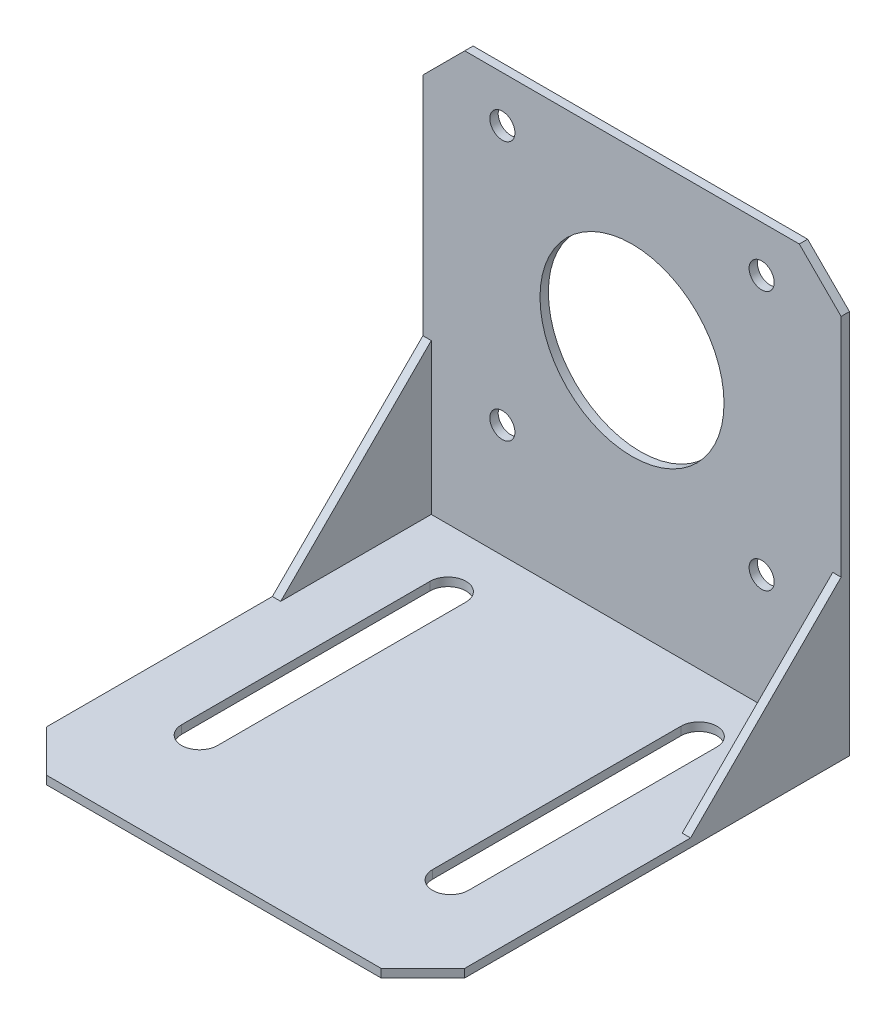
ISO-10303-21;
HEADER;
FILE_DESCRIPTION(('STEP AP214'),'2;1');
FILE_NAME('part.step','',(''),(''),'','','');
FILE_SCHEMA(('AUTOMOTIVE_DESIGN { 1 0 10303 214 1 1 1 1 }'));
ENDSEC;
DATA;
#1=APPLICATION_CONTEXT('core data for automotive mechanical design processes');
#2=APPLICATION_PROTOCOL_DEFINITION('international standard','automotive_design',2000,#1);
#3=PRODUCT_CONTEXT('',#1,'mechanical');
#4=PRODUCT('Part','Part','',(#3));
#5=PRODUCT_RELATED_PRODUCT_CATEGORY('part','',(#4));
#6=PRODUCT_DEFINITION_FORMATION('','',#4);
#7=PRODUCT_DEFINITION_CONTEXT('part definition',#1,'design');
#8=PRODUCT_DEFINITION('design','',#6,#7);
#9=PRODUCT_DEFINITION_SHAPE('','',#8);
#10=(LENGTH_UNIT() NAMED_UNIT(*) SI_UNIT(.MILLI.,.METRE.));
#11=(NAMED_UNIT(*) PLANE_ANGLE_UNIT() SI_UNIT($,.RADIAN.));
#12=(NAMED_UNIT(*) SI_UNIT($,.STERADIAN.) SOLID_ANGLE_UNIT());
#13=UNCERTAINTY_MEASURE_WITH_UNIT(LENGTH_MEASURE(1.E-05),#10,'distance_accuracy_value','');
#14=(GEOMETRIC_REPRESENTATION_CONTEXT(3) GLOBAL_UNCERTAINTY_ASSIGNED_CONTEXT((#13)) GLOBAL_UNIT_ASSIGNED_CONTEXT((#10,
#11,#12)) REPRESENTATION_CONTEXT('',''));
#15=CARTESIAN_POINT('',(0.,0.,0.));
#16=DIRECTION('',(0.,0.,1.));
#17=DIRECTION('',(1.,0.,0.));
#18=AXIS2_PLACEMENT_3D('',#15,#16,#17);
#19=CARTESIAN_POINT('',(0.,1.,0.));
#20=DIRECTION('',(0.,1.,0.));
#21=DIRECTION('',(0.,0.,1.));
#22=AXIS2_PLACEMENT_3D('',#19,#20,#21);
#23=PLANE('',#22);
#24=DIRECTION('',(1.,0.,0.));
#25=VECTOR('',#24,1.);
#26=CARTESIAN_POINT('',(0.,1.,-6.49999999999972));
#27=LINE('',#26,#25);
#28=CARTESIAN_POINT('',(24.,1.,-6.49999999999972));
#29=VERTEX_POINT('',#28);
#30=CARTESIAN_POINT('',(25.,0.999999999999998,-6.49999999999972));
#31=VERTEX_POINT('',#30);
#32=EDGE_CURVE('E353',#29,#31,#27,.T.);
#33=ORIENTED_EDGE('',*,*,#32,.F.);
#34=DIRECTION('',(0.,0.,1.));
#35=VECTOR('',#34,1.);
#36=CARTESIAN_POINT('',(24.,1.,0.));
#37=LINE('',#36,#35);
#38=CARTESIAN_POINT('',(24.,1.,-24.4999999999999));
#39=VERTEX_POINT('',#38);
#40=EDGE_CURVE('E509',#39,#29,#37,.T.);
#41=ORIENTED_EDGE('',*,*,#40,.F.);
#42=DIRECTION('',(1.,0.,0.));
#43=VECTOR('',#42,1.);
#44=CARTESIAN_POINT('',(0.,1.,-24.4999999999999));
#45=LINE('',#44,#43);
#46=CARTESIAN_POINT('',(-24.,1.,-24.4999999999999));
#47=VERTEX_POINT('',#46);
#48=EDGE_CURVE('E397',#47,#39,#45,.T.);
#49=ORIENTED_EDGE('',*,*,#48,.F.);
#50=DIRECTION('',(0.,0.,1.));
#51=VECTOR('',#50,1.);
#52=CARTESIAN_POINT('',(-24.,1.,0.));
#53=LINE('',#52,#51);
#54=CARTESIAN_POINT('',(-24.,1.,-6.4999999999997));
#55=VERTEX_POINT('',#54);
#56=EDGE_CURVE('E216',#47,#55,#53,.T.);
#57=ORIENTED_EDGE('',*,*,#56,.T.);
#58=DIRECTION('',(1.,0.,0.));
#59=VECTOR('',#58,1.);
#60=CARTESIAN_POINT('',(0.,1.,-6.49999999999971));
#61=LINE('',#60,#59);
#62=CARTESIAN_POINT('',(-25.,1.,-6.49999999999971));
#63=VERTEX_POINT('',#62);
#64=EDGE_CURVE('E220',#63,#55,#61,.T.);
#65=ORIENTED_EDGE('',*,*,#64,.F.);
#66=DIRECTION('',(0.,0.,1.));
#67=VECTOR('',#66,1.);
#68=CARTESIAN_POINT('',(-25.,1.,-25.4999999999999));
#69=LINE('',#68,#67);
#70=CARTESIAN_POINT('',(-25.,1.,20.5000000000001));
#71=VERTEX_POINT('',#70);
#72=EDGE_CURVE('E462',#63,#71,#69,.T.);
#73=ORIENTED_EDGE('',*,*,#72,.T.);
#74=DIRECTION('',(0.707106781186548,0.,0.707106781186548));
#75=VECTOR('',#74,1.);
#76=CARTESIAN_POINT('',(-25.,1.,20.5000000000001));
#77=LINE('',#76,#75);
#78=CARTESIAN_POINT('',(-20.,1.,25.5000000000001));
#79=VERTEX_POINT('',#78);
#80=EDGE_CURVE('E464',#71,#79,#77,.T.);
#81=ORIENTED_EDGE('',*,*,#80,.T.);
#82=DIRECTION('',(1.,0.,0.));
#83=VECTOR('',#82,1.);
#84=CARTESIAN_POINT('',(-20.,1.,25.5000000000001));
#85=LINE('',#84,#83);
#86=CARTESIAN_POINT('',(20.,1.,25.5000000000001));
#87=VERTEX_POINT('',#86);
#88=EDGE_CURVE('E467',#79,#87,#85,.T.);
#89=ORIENTED_EDGE('',*,*,#88,.T.);
#90=DIRECTION('',(0.707106781186548,0.,-0.707106781186548));
#91=VECTOR('',#90,1.);
#92=CARTESIAN_POINT('',(20.,1.,25.5000000000001));
#93=LINE('',#92,#91);
#94=CARTESIAN_POINT('',(25.,1.,20.5000000000001));
#95=VERTEX_POINT('',#94);
#96=EDGE_CURVE('E469',#87,#95,#93,.T.);
#97=ORIENTED_EDGE('',*,*,#96,.T.);
#98=DIRECTION('',(0.,0.,1.));
#99=VECTOR('',#98,1.);
#100=CARTESIAN_POINT('',(25.,1.,-25.4999999999999));
#101=LINE('',#100,#99);
#102=EDGE_CURVE('E472',#31,#95,#101,.T.);
#103=ORIENTED_EDGE('',*,*,#102,.F.);
#104=EDGE_LOOP('',(#33,#41,#49,#57,#65,#73,#81,#89,#97,#103));
#105=FACE_BOUND('',#104,.T.);
#106=CARTESIAN_POINT('',(-15.,1.,12.2000000000001));
#107=DIRECTION('',(0.,1.,0.));
#108=DIRECTION('',(0.,0.,1.));
#109=AXIS2_PLACEMENT_3D('',#106,#107,#108);
#110=CIRCLE('',#109,2.15);
#111=CARTESIAN_POINT('',(-17.15,1.,12.2000000000001));
#112=VERTEX_POINT('',#111);
#113=CARTESIAN_POINT('',(-12.85,1.,12.2000000000001));
#114=VERTEX_POINT('',#113);
#115=EDGE_CURVE('E433',#112,#114,#110,.T.);
#116=ORIENTED_EDGE('',*,*,#115,.F.);
#117=DIRECTION('',(0.,0.,1.));
#118=VECTOR('',#117,1.);
#119=CARTESIAN_POINT('',(-17.15,1.,0.));
#120=LINE('',#119,#118);
#121=CARTESIAN_POINT('',(-17.15,1.,-17.4999999999999));
#122=VERTEX_POINT('',#121);
#123=EDGE_CURVE('E431',#122,#112,#120,.T.);
#124=ORIENTED_EDGE('',*,*,#123,.F.);
#125=CARTESIAN_POINT('',(-15.,1.,-17.4999999999999));
#126=DIRECTION('',(0.,1.,0.));
#127=DIRECTION('',(0.,0.,1.));
#128=AXIS2_PLACEMENT_3D('',#125,#126,#127);
#129=CIRCLE('',#128,2.15);
#130=CARTESIAN_POINT('',(-12.85,1.,-17.4999999999999));
#131=VERTEX_POINT('',#130);
#132=EDGE_CURVE('E439',#131,#122,#129,.T.);
#133=ORIENTED_EDGE('',*,*,#132,.F.);
#134=DIRECTION('',(0.,0.,1.));
#135=VECTOR('',#134,1.);
#136=CARTESIAN_POINT('',(-12.85,1.,0.));
#137=LINE('',#136,#135);
#138=EDGE_CURVE('E436',#131,#114,#137,.T.);
#139=ORIENTED_EDGE('',*,*,#138,.T.);
#140=EDGE_LOOP('',(#116,#124,#133,#139));
#141=FACE_BOUND('',#140,.T.);
#142=CARTESIAN_POINT('',(15.,1.,12.2000000000001));
#143=DIRECTION('',(0.,1.,0.));
#144=DIRECTION('',(0.,0.,1.));
#145=AXIS2_PLACEMENT_3D('',#142,#143,#144);
#146=CIRCLE('',#145,2.15);
#147=CARTESIAN_POINT('',(12.85,1.,12.2000000000001));
#148=VERTEX_POINT('',#147);
#149=CARTESIAN_POINT('',(17.15,1.,12.2000000000001));
#150=VERTEX_POINT('',#149);
#151=EDGE_CURVE('E402',#148,#150,#146,.T.);
#152=ORIENTED_EDGE('',*,*,#151,.F.);
#153=DIRECTION('',(0.,0.,1.));
#154=VECTOR('',#153,1.);
#155=CARTESIAN_POINT('',(12.85,1.,0.));
#156=LINE('',#155,#154);
#157=CARTESIAN_POINT('',(12.85,1.,-17.4999999999999));
#158=VERTEX_POINT('',#157);
#159=EDGE_CURVE('E400',#158,#148,#156,.T.);
#160=ORIENTED_EDGE('',*,*,#159,.F.);
#161=CARTESIAN_POINT('',(15.,1.,-17.4999999999999));
#162=DIRECTION('',(0.,1.,0.));
#163=DIRECTION('',(0.,0.,1.));
#164=AXIS2_PLACEMENT_3D('',#161,#162,#163);
#165=CIRCLE('',#164,2.15);
#166=CARTESIAN_POINT('',(17.15,1.,-17.4999999999999));
#167=VERTEX_POINT('',#166);
#168=EDGE_CURVE('E408',#167,#158,#165,.T.);
#169=ORIENTED_EDGE('',*,*,#168,.F.);
#170=DIRECTION('',(0.,0.,1.));
#171=VECTOR('',#170,1.);
#172=CARTESIAN_POINT('',(17.15,1.,0.));
#173=LINE('',#172,#171);
#174=EDGE_CURVE('E405',#167,#150,#173,.T.);
#175=ORIENTED_EDGE('',*,*,#174,.T.);
#176=EDGE_LOOP('',(#152,#160,#169,#175));
#177=FACE_BOUND('',#176,.T.);
#178=ADVANCED_FACE('F201',(#105,#141,#177),#23,.T.);
#179=CARTESIAN_POINT('',(0.,0.,0.));
#180=DIRECTION('',(0.,1.,0.));
#181=DIRECTION('',(0.,0.,1.));
#182=AXIS2_PLACEMENT_3D('',#179,#180,#181);
#183=PLANE('',#182);
#184=DIRECTION('',(0.,0.,1.));
#185=VECTOR('',#184,1.);
#186=CARTESIAN_POINT('',(25.,0.,-25.4999999999999));
#187=LINE('',#186,#185);
#188=CARTESIAN_POINT('',(25.,0.,-25.4999999999999));
#189=VERTEX_POINT('',#188);
#190=CARTESIAN_POINT('',(25.,0.,20.5000000000001));
#191=VERTEX_POINT('',#190);
#192=EDGE_CURVE('E483',#189,#191,#187,.T.);
#193=ORIENTED_EDGE('',*,*,#192,.T.);
#194=DIRECTION('',(0.707106781186548,0.,-0.707106781186548));
#195=VECTOR('',#194,1.);
#196=CARTESIAN_POINT('',(20.,0.,25.5000000000001));
#197=LINE('',#196,#195);
#198=CARTESIAN_POINT('',(20.,0.,25.5000000000001));
#199=VERTEX_POINT('',#198);
#200=EDGE_CURVE('E480',#199,#191,#197,.T.);
#201=ORIENTED_EDGE('',*,*,#200,.F.);
#202=DIRECTION('',(1.,0.,0.));
#203=VECTOR('',#202,1.);
#204=CARTESIAN_POINT('',(-20.,0.,25.5000000000001));
#205=LINE('',#204,#203);
#206=CARTESIAN_POINT('',(-20.,0.,25.5000000000001));
#207=VERTEX_POINT('',#206);
#208=EDGE_CURVE('E478',#207,#199,#205,.T.);
#209=ORIENTED_EDGE('',*,*,#208,.F.);
#210=DIRECTION('',(0.707106781186548,0.,0.707106781186548));
#211=VECTOR('',#210,1.);
#212=CARTESIAN_POINT('',(-25.,0.,20.5000000000001));
#213=LINE('',#212,#211);
#214=CARTESIAN_POINT('',(-25.,0.,20.5000000000001));
#215=VERTEX_POINT('',#214);
#216=EDGE_CURVE('E476',#215,#207,#213,.T.);
#217=ORIENTED_EDGE('',*,*,#216,.F.);
#218=DIRECTION('',(0.,0.,1.));
#219=VECTOR('',#218,1.);
#220=CARTESIAN_POINT('',(-25.,0.,-25.4999999999999));
#221=LINE('',#220,#219);
#222=CARTESIAN_POINT('',(-25.,0.,-25.4999999999999));
#223=VERTEX_POINT('',#222);
#224=EDGE_CURVE('E461',#223,#215,#221,.T.);
#225=ORIENTED_EDGE('',*,*,#224,.F.);
#226=DIRECTION('',(1.,0.,0.));
#227=VECTOR('',#226,1.);
#228=CARTESIAN_POINT('',(-25.,0.,-25.4999999999999));
#229=LINE('',#228,#227);
#230=EDGE_CURVE('E465',#223,#189,#229,.T.);
#231=ORIENTED_EDGE('',*,*,#230,.T.);
#232=EDGE_LOOP('',(#193,#201,#209,#217,#225,#231));
#233=FACE_BOUND('',#232,.T.);
#234=DIRECTION('',(0.,0.,1.));
#235=VECTOR('',#234,1.);
#236=CARTESIAN_POINT('',(-17.15,0.,0.));
#237=LINE('',#236,#235);
#238=CARTESIAN_POINT('',(-17.15,0.,-17.4999999999999));
#239=VERTEX_POINT('',#238);
#240=CARTESIAN_POINT('',(-17.15,0.,12.2000000000001));
#241=VERTEX_POINT('',#240);
#242=EDGE_CURVE('E430',#239,#241,#237,.T.);
#243=ORIENTED_EDGE('',*,*,#242,.T.);
#244=CARTESIAN_POINT('',(-15.,0.,12.2000000000001));
#245=DIRECTION('',(0.,1.,0.));
#246=DIRECTION('',(0.,0.,1.));
#247=AXIS2_PLACEMENT_3D('',#244,#245,#246);
#248=CIRCLE('',#247,2.15);
#249=CARTESIAN_POINT('',(-12.85,0.,12.2000000000001));
#250=VERTEX_POINT('',#249);
#251=EDGE_CURVE('E444',#241,#250,#248,.T.);
#252=ORIENTED_EDGE('',*,*,#251,.T.);
#253=DIRECTION('',(0.,0.,1.));
#254=VECTOR('',#253,1.);
#255=CARTESIAN_POINT('',(-12.85,0.,0.));
#256=LINE('',#255,#254);
#257=CARTESIAN_POINT('',(-12.85,0.,-17.4999999999999));
#258=VERTEX_POINT('',#257);
#259=EDGE_CURVE('E447',#258,#250,#256,.T.);
#260=ORIENTED_EDGE('',*,*,#259,.F.);
#261=CARTESIAN_POINT('',(-15.,0.,-17.4999999999999));
#262=DIRECTION('',(0.,1.,0.));
#263=DIRECTION('',(0.,0.,1.));
#264=AXIS2_PLACEMENT_3D('',#261,#262,#263);
#265=CIRCLE('',#264,2.15);
#266=EDGE_CURVE('E434',#258,#239,#265,.T.);
#267=ORIENTED_EDGE('',*,*,#266,.T.);
#268=EDGE_LOOP('',(#243,#252,#260,#267));
#269=FACE_BOUND('',#268,.T.);
#270=DIRECTION('',(0.,0.,1.));
#271=VECTOR('',#270,1.);
#272=CARTESIAN_POINT('',(12.85,0.,0.));
#273=LINE('',#272,#271);
#274=CARTESIAN_POINT('',(12.85,0.,-17.4999999999999));
#275=VERTEX_POINT('',#274);
#276=CARTESIAN_POINT('',(12.85,0.,12.2000000000001));
#277=VERTEX_POINT('',#276);
#278=EDGE_CURVE('E399',#275,#277,#273,.T.);
#279=ORIENTED_EDGE('',*,*,#278,.T.);
#280=CARTESIAN_POINT('',(15.,0.,12.2000000000001));
#281=DIRECTION('',(0.,1.,0.));
#282=DIRECTION('',(0.,0.,1.));
#283=AXIS2_PLACEMENT_3D('',#280,#281,#282);
#284=CIRCLE('',#283,2.15);
#285=CARTESIAN_POINT('',(17.15,0.,12.2000000000001));
#286=VERTEX_POINT('',#285);
#287=EDGE_CURVE('E413',#277,#286,#284,.T.);
#288=ORIENTED_EDGE('',*,*,#287,.T.);
#289=DIRECTION('',(0.,0.,1.));
#290=VECTOR('',#289,1.);
#291=CARTESIAN_POINT('',(17.15,0.,0.));
#292=LINE('',#291,#290);
#293=CARTESIAN_POINT('',(17.15,0.,-17.4999999999999));
#294=VERTEX_POINT('',#293);
#295=EDGE_CURVE('E416',#294,#286,#292,.T.);
#296=ORIENTED_EDGE('',*,*,#295,.F.);
#297=CARTESIAN_POINT('',(15.,0.,-17.4999999999999));
#298=DIRECTION('',(0.,1.,0.));
#299=DIRECTION('',(0.,0.,1.));
#300=AXIS2_PLACEMENT_3D('',#297,#298,#299);
#301=CIRCLE('',#300,2.15);
#302=EDGE_CURVE('E403',#294,#275,#301,.T.);
#303=ORIENTED_EDGE('',*,*,#302,.T.);
#304=EDGE_LOOP('',(#279,#288,#296,#303));
#305=FACE_BOUND('',#304,.T.);
#306=ADVANCED_FACE('F586',(#233,#269,#305),#183,.F.);
#307=CARTESIAN_POINT('',(-25.,1.,-25.4999999999999));
#308=DIRECTION('',(1.,0.,0.));
#309=DIRECTION('',(0.,0.,-1.));
#310=AXIS2_PLACEMENT_3D('',#307,#308,#309);
#311=PLANE('',#310);
#312=ORIENTED_EDGE('',*,*,#72,.F.);
#313=DIRECTION('',(0.,0.707106781186544,-0.707106781186551));
#314=VECTOR('',#313,1.);
#315=CARTESIAN_POINT('',(-25.,0.,-5.49999999999969));
#316=LINE('',#315,#314);
#317=CARTESIAN_POINT('',(-25.,19.,-24.4999999999999));
#318=VERTEX_POINT('',#317);
#319=EDGE_CURVE('E522',#63,#318,#316,.T.);
#320=ORIENTED_EDGE('',*,*,#319,.T.);
#321=DIRECTION('',(0.,-1.,0.));
#322=VECTOR('',#321,1.);
#323=CARTESIAN_POINT('',(-25.,46.,-24.4999999999999));
#324=LINE('',#323,#322);
#325=CARTESIAN_POINT('',(-25.,46.,-24.4999999999999));
#326=VERTEX_POINT('',#325);
#327=EDGE_CURVE('E371',#326,#318,#324,.T.);
#328=ORIENTED_EDGE('',*,*,#327,.F.);
#329=DIRECTION('',(0.,0.,-1.));
#330=VECTOR('',#329,1.);
#331=CARTESIAN_POINT('',(-25.,46.,-24.4999999999999));
#332=LINE('',#331,#330);
#333=CARTESIAN_POINT('',(-25.,46.,-25.4999999999999));
#334=VERTEX_POINT('',#333);
#335=EDGE_CURVE('E373',#326,#334,#332,.T.);
#336=ORIENTED_EDGE('',*,*,#335,.T.);
#337=DIRECTION('',(0.,-1.,0.));
#338=VECTOR('',#337,1.);
#339=CARTESIAN_POINT('',(-25.,1.,-25.4999999999999));
#340=LINE('',#339,#338);
#341=EDGE_CURVE('E474',#334,#223,#340,.T.);
#342=ORIENTED_EDGE('',*,*,#341,.T.);
#343=ORIENTED_EDGE('',*,*,#224,.T.);
#344=DIRECTION('',(0.,-1.,0.));
#345=VECTOR('',#344,1.);
#346=CARTESIAN_POINT('',(-25.,1.,20.5000000000001));
#347=LINE('',#346,#345);
#348=EDGE_CURVE('E499',#71,#215,#347,.T.);
#349=ORIENTED_EDGE('',*,*,#348,.F.);
#350=EDGE_LOOP('',(#312,#320,#328,#336,#342,#343,#349));
#351=FACE_BOUND('',#350,.T.);
#352=ADVANCED_FACE('F203',(#351),#311,.F.);
#353=CARTESIAN_POINT('',(-25.,1.,20.5000000000001));
#354=DIRECTION('',(0.707106781186547,0.,-0.707106781186547));
#355=DIRECTION('',(-0.707106781186548,0.,-0.707106781186548));
#356=AXIS2_PLACEMENT_3D('',#353,#354,#355);
#357=PLANE('',#356);
#358=ORIENTED_EDGE('',*,*,#216,.T.);
#359=DIRECTION('',(0.,-1.,0.));
#360=VECTOR('',#359,1.);
#361=CARTESIAN_POINT('',(-20.,1.,25.5000000000001));
#362=LINE('',#361,#360);
#363=EDGE_CURVE('E496',#79,#207,#362,.T.);
#364=ORIENTED_EDGE('',*,*,#363,.F.);
#365=ORIENTED_EDGE('',*,*,#80,.F.);
#366=ORIENTED_EDGE('',*,*,#348,.T.);
#367=EDGE_LOOP('',(#358,#364,#365,#366));
#368=FACE_BOUND('',#367,.T.);
#369=ADVANCED_FACE('F572',(#368),#357,.F.);
#370=CARTESIAN_POINT('',(-20.,1.,25.5000000000001));
#371=DIRECTION('',(0.,0.,-1.));
#372=DIRECTION('',(-1.,0.,0.));
#373=AXIS2_PLACEMENT_3D('',#370,#371,#372);
#374=PLANE('',#373);
#375=ORIENTED_EDGE('',*,*,#208,.T.);
#376=DIRECTION('',(0.,-1.,0.));
#377=VECTOR('',#376,1.);
#378=CARTESIAN_POINT('',(20.,1.,25.5000000000001));
#379=LINE('',#378,#377);
#380=EDGE_CURVE('E493',#87,#199,#379,.T.);
#381=ORIENTED_EDGE('',*,*,#380,.F.);
#382=ORIENTED_EDGE('',*,*,#88,.F.);
#383=ORIENTED_EDGE('',*,*,#363,.T.);
#384=EDGE_LOOP('',(#375,#381,#382,#383));
#385=FACE_BOUND('',#384,.T.);
#386=ADVANCED_FACE('F578',(#385),#374,.F.);
#387=CARTESIAN_POINT('',(20.,1.,25.5000000000001));
#388=DIRECTION('',(-0.707106781186547,0.,-0.707106781186547));
#389=DIRECTION('',(-0.707106781186548,0.,0.707106781186548));
#390=AXIS2_PLACEMENT_3D('',#387,#388,#389);
#391=PLANE('',#390);
#392=ORIENTED_EDGE('',*,*,#200,.T.);
#393=DIRECTION('',(0.,-1.,0.));
#394=VECTOR('',#393,1.);
#395=CARTESIAN_POINT('',(25.,1.,20.5000000000001));
#396=LINE('',#395,#394);
#397=EDGE_CURVE('E490',#95,#191,#396,.T.);
#398=ORIENTED_EDGE('',*,*,#397,.F.);
#399=ORIENTED_EDGE('',*,*,#96,.F.);
#400=ORIENTED_EDGE('',*,*,#380,.T.);
#401=EDGE_LOOP('',(#392,#398,#399,#400));
#402=FACE_BOUND('',#401,.T.);
#403=ADVANCED_FACE('F582',(#402),#391,.F.);
#404=CARTESIAN_POINT('',(25.,1.,-25.4999999999999));
#405=DIRECTION('',(1.,0.,0.));
#406=DIRECTION('',(0.,0.,-1.));
#407=AXIS2_PLACEMENT_3D('',#404,#405,#406);
#408=PLANE('',#407);
#409=DIRECTION('',(0.,-0.707106781186544,0.707106781186551));
#410=VECTOR('',#409,1.);
#411=CARTESIAN_POINT('',(25.,0.,-5.49999999999971));
#412=LINE('',#411,#410);
#413=CARTESIAN_POINT('',(25.,19.,-24.4999999999999));
#414=VERTEX_POINT('',#413);
#415=EDGE_CURVE('E347',#414,#31,#412,.T.);
#416=ORIENTED_EDGE('',*,*,#415,.T.);
#417=ORIENTED_EDGE('',*,*,#102,.T.);
#418=ORIENTED_EDGE('',*,*,#397,.T.);
#419=ORIENTED_EDGE('',*,*,#192,.F.);
#420=DIRECTION('',(0.,-1.,0.));
#421=VECTOR('',#420,1.);
#422=CARTESIAN_POINT('',(25.,1.,-25.4999999999999));
#423=LINE('',#422,#421);
#424=CARTESIAN_POINT('',(25.,46.,-25.4999999999999));
#425=VERTEX_POINT('',#424);
#426=EDGE_CURVE('E487',#425,#189,#423,.T.);
#427=ORIENTED_EDGE('',*,*,#426,.F.);
#428=DIRECTION('',(0.,0.,-1.));
#429=VECTOR('',#428,1.);
#430=CARTESIAN_POINT('',(25.,46.,-24.4999999999999));
#431=LINE('',#430,#429);
#432=CARTESIAN_POINT('',(25.,46.,-24.4999999999999));
#433=VERTEX_POINT('',#432);
#434=EDGE_CURVE('E369',#433,#425,#431,.T.);
#435=ORIENTED_EDGE('',*,*,#434,.F.);
#436=DIRECTION('',(0.,-1.,0.));
#437=VECTOR('',#436,1.);
#438=CARTESIAN_POINT('',(25.,46.,-24.4999999999999));
#439=LINE('',#438,#437);
#440=EDGE_CURVE('E365',#433,#414,#439,.T.);
#441=ORIENTED_EDGE('',*,*,#440,.T.);
#442=EDGE_LOOP('',(#416,#417,#418,#419,#427,#435,#441));
#443=FACE_BOUND('',#442,.T.);
#444=ADVANCED_FACE('F367',(#443),#408,.T.);
#445=CARTESIAN_POINT('',(-25.,1.,-25.4999999999999));
#446=DIRECTION('',(0.,0.,-1.));
#447=DIRECTION('',(-1.,0.,0.));
#448=AXIS2_PLACEMENT_3D('',#445,#446,#447);
#449=PLANE('',#448);
#450=ORIENTED_EDGE('',*,*,#426,.T.);
#451=ORIENTED_EDGE('',*,*,#230,.F.);
#452=ORIENTED_EDGE('',*,*,#341,.F.);
#453=DIRECTION('',(-0.707106781186548,-0.707106781186547,0.));
#454=VECTOR('',#453,1.);
#455=CARTESIAN_POINT('',(-20.,51.,-25.4999999999999));
#456=LINE('',#455,#454);
#457=CARTESIAN_POINT('',(-20.,51.,-25.4999999999999));
#458=VERTEX_POINT('',#457);
#459=EDGE_CURVE('E385',#458,#334,#456,.T.);
#460=ORIENTED_EDGE('',*,*,#459,.F.);
#461=DIRECTION('',(-1.,0.,0.));
#462=VECTOR('',#461,1.);
#463=CARTESIAN_POINT('',(20.,51.,-25.4999999999999));
#464=LINE('',#463,#462);
#465=CARTESIAN_POINT('',(20.,51.,-25.4999999999999));
#466=VERTEX_POINT('',#465);
#467=EDGE_CURVE('E382',#466,#458,#464,.T.);
#468=ORIENTED_EDGE('',*,*,#467,.F.);
#469=DIRECTION('',(-0.707106781186547,0.707106781186547,0.));
#470=VECTOR('',#469,1.);
#471=CARTESIAN_POINT('',(25.,46.,-25.4999999999999));
#472=LINE('',#471,#470);
#473=EDGE_CURVE('E379',#425,#466,#472,.T.);
#474=ORIENTED_EDGE('',*,*,#473,.F.);
#475=EDGE_LOOP('',(#450,#451,#452,#460,#468,#474));
#476=FACE_BOUND('',#475,.T.);
#477=CARTESIAN_POINT('',(15.5,14.5,-25.4999999999999));
#478=DIRECTION('',(0.,0.,-1.));
#479=DIRECTION('',(-1.,0.,0.));
#480=AXIS2_PLACEMENT_3D('',#477,#478,#479);
#481=CIRCLE('',#480,1.5);
#482=CARTESIAN_POINT('',(14.,14.5,-25.4999999999999));
#483=VERTEX_POINT('',#482);
#484=EDGE_CURVE('E529',#483,#483,#481,.T.);
#485=ORIENTED_EDGE('',*,*,#484,.F.);
#486=EDGE_LOOP('',(#485));
#487=FACE_BOUND('',#486,.T.);
#488=CARTESIAN_POINT('',(-15.5,14.5,-25.4999999999999));
#489=DIRECTION('',(0.,0.,-1.));
#490=DIRECTION('',(-1.,0.,0.));
#491=AXIS2_PLACEMENT_3D('',#488,#489,#490);
#492=CIRCLE('',#491,1.5);
#493=CARTESIAN_POINT('',(-17.,14.5,-25.4999999999999));
#494=VERTEX_POINT('',#493);
#495=EDGE_CURVE('E533',#494,#494,#492,.T.);
#496=ORIENTED_EDGE('',*,*,#495,.F.);
#497=EDGE_LOOP('',(#496));
#498=FACE_BOUND('',#497,.T.);
#499=CARTESIAN_POINT('',(-15.5,45.5,-25.4999999999999));
#500=DIRECTION('',(0.,0.,-1.));
#501=DIRECTION('',(-1.,0.,0.));
#502=AXIS2_PLACEMENT_3D('',#499,#500,#501);
#503=CIRCLE('',#502,1.5);
#504=CARTESIAN_POINT('',(-17.,45.5,-25.4999999999999));
#505=VERTEX_POINT('',#504);
#506=EDGE_CURVE('E539',#505,#505,#503,.T.);
#507=ORIENTED_EDGE('',*,*,#506,.F.);
#508=EDGE_LOOP('',(#507));
#509=FACE_BOUND('',#508,.T.);
#510=CARTESIAN_POINT('',(15.5,45.5,-25.4999999999999));
#511=DIRECTION('',(0.,0.,-1.));
#512=DIRECTION('',(-1.,0.,0.));
#513=AXIS2_PLACEMENT_3D('',#510,#511,#512);
#514=CIRCLE('',#513,1.5);
#515=CARTESIAN_POINT('',(14.,45.5,-25.4999999999999));
#516=VERTEX_POINT('',#515);
#517=EDGE_CURVE('E545',#516,#516,#514,.T.);
#518=ORIENTED_EDGE('',*,*,#517,.F.);
#519=EDGE_LOOP('',(#518));
#520=FACE_BOUND('',#519,.T.);
#521=CARTESIAN_POINT('',(0.,30.,-25.4999999999999));
#522=DIRECTION('',(0.,0.,-1.));
#523=DIRECTION('',(-1.,0.,0.));
#524=AXIS2_PLACEMENT_3D('',#521,#522,#523);
#525=CIRCLE('',#524,11.);
#526=CARTESIAN_POINT('',(-11.,30.,-25.4999999999999));
#527=VERTEX_POINT('',#526);
#528=EDGE_CURVE('E551',#527,#527,#525,.T.);
#529=ORIENTED_EDGE('',*,*,#528,.F.);
#530=EDGE_LOOP('',(#529));
#531=FACE_BOUND('',#530,.T.);
#532=ADVANCED_FACE('F592',(#476,#487,#498,#509,#520,#531),#449,.T.);
#533=CARTESIAN_POINT('',(-17.15,1.,0.));
#534=DIRECTION('',(1.,0.,0.));
#535=DIRECTION('',(0.,0.,-1.));
#536=AXIS2_PLACEMENT_3D('',#533,#534,#535);
#537=PLANE('',#536);
#538=ORIENTED_EDGE('',*,*,#242,.F.);
#539=DIRECTION('',(0.,-1.,0.));
#540=VECTOR('',#539,1.);
#541=CARTESIAN_POINT('',(-17.15,1.,-17.4999999999999));
#542=LINE('',#541,#540);
#543=EDGE_CURVE('E441',#122,#239,#542,.T.);
#544=ORIENTED_EDGE('',*,*,#543,.F.);
#545=ORIENTED_EDGE('',*,*,#123,.T.);
#546=DIRECTION('',(0.,-1.,0.));
#547=VECTOR('',#546,1.);
#548=CARTESIAN_POINT('',(-17.15,1.,12.2000000000001));
#549=LINE('',#548,#547);
#550=EDGE_CURVE('E458',#112,#241,#549,.T.);
#551=ORIENTED_EDGE('',*,*,#550,.T.);
#552=EDGE_LOOP('',(#538,#544,#545,#551));
#553=FACE_BOUND('',#552,.T.);
#554=ADVANCED_FACE('F615',(#553),#537,.T.);
#555=CARTESIAN_POINT('',(-15.,1.,12.2000000000001));
#556=DIRECTION('',(0.,-1.,0.));
#557=DIRECTION('',(0.,0.,-1.));
#558=AXIS2_PLACEMENT_3D('',#555,#556,#557);
#559=CYLINDRICAL_SURFACE('',#558,2.15);
#560=ORIENTED_EDGE('',*,*,#251,.F.);
#561=ORIENTED_EDGE('',*,*,#550,.F.);
#562=ORIENTED_EDGE('',*,*,#115,.T.);
#563=DIRECTION('',(0.,-1.,0.));
#564=VECTOR('',#563,1.);
#565=CARTESIAN_POINT('',(-12.85,1.,12.2000000000001));
#566=LINE('',#565,#564);
#567=EDGE_CURVE('E456',#114,#250,#566,.T.);
#568=ORIENTED_EDGE('',*,*,#567,.T.);
#569=EDGE_LOOP('',(#560,#561,#562,#568));
#570=FACE_BOUND('',#569,.T.);
#571=ADVANCED_FACE('F786',(#570),#559,.F.);
#572=CARTESIAN_POINT('',(-12.85,1.,0.));
#573=DIRECTION('',(1.,0.,0.));
#574=DIRECTION('',(0.,0.,-1.));
#575=AXIS2_PLACEMENT_3D('',#572,#573,#574);
#576=PLANE('',#575);
#577=ORIENTED_EDGE('',*,*,#259,.T.);
#578=ORIENTED_EDGE('',*,*,#567,.F.);
#579=ORIENTED_EDGE('',*,*,#138,.F.);
#580=DIRECTION('',(0.,-1.,0.));
#581=VECTOR('',#580,1.);
#582=CARTESIAN_POINT('',(-12.85,1.,-17.4999999999999));
#583=LINE('',#582,#581);
#584=EDGE_CURVE('E454',#131,#258,#583,.T.);
#585=ORIENTED_EDGE('',*,*,#584,.T.);
#586=EDGE_LOOP('',(#577,#578,#579,#585));
#587=FACE_BOUND('',#586,.T.);
#588=ADVANCED_FACE('F794',(#587),#576,.F.);
#589=CARTESIAN_POINT('',(-15.,1.,-17.4999999999999));
#590=DIRECTION('',(0.,-1.,0.));
#591=DIRECTION('',(0.,0.,-1.));
#592=AXIS2_PLACEMENT_3D('',#589,#590,#591);
#593=CYLINDRICAL_SURFACE('',#592,2.15);
#594=ORIENTED_EDGE('',*,*,#266,.F.);
#595=ORIENTED_EDGE('',*,*,#584,.F.);
#596=ORIENTED_EDGE('',*,*,#132,.T.);
#597=ORIENTED_EDGE('',*,*,#543,.T.);
#598=EDGE_LOOP('',(#594,#595,#596,#597));
#599=FACE_BOUND('',#598,.T.);
#600=ADVANCED_FACE('F802',(#599),#593,.F.);
#601=CARTESIAN_POINT('',(12.85,1.,0.));
#602=DIRECTION('',(1.,0.,0.));
#603=DIRECTION('',(0.,0.,-1.));
#604=AXIS2_PLACEMENT_3D('',#601,#602,#603);
#605=PLANE('',#604);
#606=ORIENTED_EDGE('',*,*,#278,.F.);
#607=DIRECTION('',(0.,-1.,0.));
#608=VECTOR('',#607,1.);
#609=CARTESIAN_POINT('',(12.85,1.,-17.4999999999999));
#610=LINE('',#609,#608);
#611=EDGE_CURVE('E410',#158,#275,#610,.T.);
#612=ORIENTED_EDGE('',*,*,#611,.F.);
#613=ORIENTED_EDGE('',*,*,#159,.T.);
#614=DIRECTION('',(0.,-1.,0.));
#615=VECTOR('',#614,1.);
#616=CARTESIAN_POINT('',(12.85,1.,12.2000000000001));
#617=LINE('',#616,#615);
#618=EDGE_CURVE('E427',#148,#277,#617,.T.);
#619=ORIENTED_EDGE('',*,*,#618,.T.);
#620=EDGE_LOOP('',(#606,#612,#613,#619));
#621=FACE_BOUND('',#620,.T.);
#622=ADVANCED_FACE('F811',(#621),#605,.T.);
#623=CARTESIAN_POINT('',(15.,1.,12.2000000000001));
#624=DIRECTION('',(0.,-1.,0.));
#625=DIRECTION('',(0.,0.,-1.));
#626=AXIS2_PLACEMENT_3D('',#623,#624,#625);
#627=CYLINDRICAL_SURFACE('',#626,2.15);
#628=ORIENTED_EDGE('',*,*,#287,.F.);
#629=ORIENTED_EDGE('',*,*,#618,.F.);
#630=ORIENTED_EDGE('',*,*,#151,.T.);
#631=DIRECTION('',(0.,-1.,0.));
#632=VECTOR('',#631,1.);
#633=CARTESIAN_POINT('',(17.15,1.,12.2000000000001));
#634=LINE('',#633,#632);
#635=EDGE_CURVE('E425',#150,#286,#634,.T.);
#636=ORIENTED_EDGE('',*,*,#635,.T.);
#637=EDGE_LOOP('',(#628,#629,#630,#636));
#638=FACE_BOUND('',#637,.T.);
#639=ADVANCED_FACE('F820',(#638),#627,.F.);
#640=CARTESIAN_POINT('',(17.15,1.,0.));
#641=DIRECTION('',(1.,0.,0.));
#642=DIRECTION('',(0.,0.,-1.));
#643=AXIS2_PLACEMENT_3D('',#640,#641,#642);
#644=PLANE('',#643);
#645=ORIENTED_EDGE('',*,*,#295,.T.);
#646=ORIENTED_EDGE('',*,*,#635,.F.);
#647=ORIENTED_EDGE('',*,*,#174,.F.);
#648=DIRECTION('',(0.,-1.,0.));
#649=VECTOR('',#648,1.);
#650=CARTESIAN_POINT('',(17.15,1.,-17.4999999999999));
#651=LINE('',#650,#649);
#652=EDGE_CURVE('E423',#167,#294,#651,.T.);
#653=ORIENTED_EDGE('',*,*,#652,.T.);
#654=EDGE_LOOP('',(#645,#646,#647,#653));
#655=FACE_BOUND('',#654,.T.);
#656=ADVANCED_FACE('F828',(#655),#644,.F.);
#657=CARTESIAN_POINT('',(15.,1.,-17.4999999999999));
#658=DIRECTION('',(0.,-1.,0.));
#659=DIRECTION('',(0.,0.,-1.));
#660=AXIS2_PLACEMENT_3D('',#657,#658,#659);
#661=CYLINDRICAL_SURFACE('',#660,2.15);
#662=ORIENTED_EDGE('',*,*,#302,.F.);
#663=ORIENTED_EDGE('',*,*,#652,.F.);
#664=ORIENTED_EDGE('',*,*,#168,.T.);
#665=ORIENTED_EDGE('',*,*,#611,.T.);
#666=EDGE_LOOP('',(#662,#663,#664,#665));
#667=FACE_BOUND('',#666,.T.);
#668=ADVANCED_FACE('F606',(#667),#661,.F.);
#669=CARTESIAN_POINT('',(25.,46.,-24.4999999999999));
#670=DIRECTION('',(-0.707106781186547,-0.707106781186547,0.));
#671=DIRECTION('',(0.707106781186548,-0.707106781186548,0.));
#672=AXIS2_PLACEMENT_3D('',#669,#670,#671);
#673=PLANE('',#672);
#674=ORIENTED_EDGE('',*,*,#473,.T.);
#675=DIRECTION('',(0.,0.,-1.));
#676=VECTOR('',#675,1.);
#677=CARTESIAN_POINT('',(20.,51.,-24.4999999999999));
#678=LINE('',#677,#676);
#679=CARTESIAN_POINT('',(20.,51.,-24.4999999999999));
#680=VERTEX_POINT('',#679);
#681=EDGE_CURVE('E394',#680,#466,#678,.T.);
#682=ORIENTED_EDGE('',*,*,#681,.F.);
#683=DIRECTION('',(-0.707106781186547,0.707106781186547,0.));
#684=VECTOR('',#683,1.);
#685=CARTESIAN_POINT('',(25.,46.,-24.4999999999999));
#686=LINE('',#685,#684);
#687=EDGE_CURVE('E387',#433,#680,#686,.T.);
#688=ORIENTED_EDGE('',*,*,#687,.F.);
#689=ORIENTED_EDGE('',*,*,#434,.T.);
#690=EDGE_LOOP('',(#674,#682,#688,#689));
#691=FACE_BOUND('',#690,.T.);
#692=ADVANCED_FACE('F596',(#691),#673,.F.);
#693=CARTESIAN_POINT('',(20.,51.,-24.4999999999999));
#694=DIRECTION('',(0.,-1.,0.));
#695=DIRECTION('',(0.,0.,-1.));
#696=AXIS2_PLACEMENT_3D('',#693,#694,#695);
#697=PLANE('',#696);
#698=ORIENTED_EDGE('',*,*,#467,.T.);
#699=DIRECTION('',(0.,0.,-1.));
#700=VECTOR('',#699,1.);
#701=CARTESIAN_POINT('',(-20.,51.,-24.4999999999999));
#702=LINE('',#701,#700);
#703=CARTESIAN_POINT('',(-20.,51.,-24.4999999999999));
#704=VERTEX_POINT('',#703);
#705=EDGE_CURVE('E391',#704,#458,#702,.T.);
#706=ORIENTED_EDGE('',*,*,#705,.F.);
#707=DIRECTION('',(-1.,0.,0.));
#708=VECTOR('',#707,1.);
#709=CARTESIAN_POINT('',(20.,51.,-24.4999999999999));
#710=LINE('',#709,#708);
#711=EDGE_CURVE('E559',#680,#704,#710,.T.);
#712=ORIENTED_EDGE('',*,*,#711,.F.);
#713=ORIENTED_EDGE('',*,*,#681,.T.);
#714=EDGE_LOOP('',(#698,#706,#712,#713));
#715=FACE_BOUND('',#714,.T.);
#716=ADVANCED_FACE('F598',(#715),#697,.F.);
#717=CARTESIAN_POINT('',(-20.,51.,-24.4999999999999));
#718=DIRECTION('',(0.707106781186547,-0.707106781186548,0.));
#719=DIRECTION('',(0.707106781186548,0.707106781186547,0.));
#720=AXIS2_PLACEMENT_3D('',#717,#718,#719);
#721=PLANE('',#720);
#722=ORIENTED_EDGE('',*,*,#459,.T.);
#723=ORIENTED_EDGE('',*,*,#335,.F.);
#724=DIRECTION('',(-0.707106781186548,-0.707106781186547,0.));
#725=VECTOR('',#724,1.);
#726=CARTESIAN_POINT('',(-20.,51.,-24.4999999999999));
#727=LINE('',#726,#725);
#728=EDGE_CURVE('E375',#704,#326,#727,.T.);
#729=ORIENTED_EDGE('',*,*,#728,.F.);
#730=ORIENTED_EDGE('',*,*,#705,.T.);
#731=EDGE_LOOP('',(#722,#723,#729,#730));
#732=FACE_BOUND('',#731,.T.);
#733=ADVANCED_FACE('F565',(#732),#721,.F.);
#734=CARTESIAN_POINT('',(0.,0.,-24.4999999999999));
#735=DIRECTION('',(0.,0.,1.));
#736=DIRECTION('',(1.,0.,0.));
#737=AXIS2_PLACEMENT_3D('',#734,#735,#736);
#738=PLANE('',#737);
#739=DIRECTION('',(-1.,0.,0.));
#740=VECTOR('',#739,1.);
#741=CARTESIAN_POINT('',(0.,19.,-24.4999999999999));
#742=LINE('',#741,#740);
#743=CARTESIAN_POINT('',(24.,19.,-24.4999999999999));
#744=VERTEX_POINT('',#743);
#745=EDGE_CURVE('E12',#414,#744,#742,.T.);
#746=ORIENTED_EDGE('',*,*,#745,.F.);
#747=ORIENTED_EDGE('',*,*,#440,.F.);
#748=ORIENTED_EDGE('',*,*,#687,.T.);
#749=ORIENTED_EDGE('',*,*,#711,.T.);
#750=ORIENTED_EDGE('',*,*,#728,.T.);
#751=ORIENTED_EDGE('',*,*,#327,.T.);
#752=DIRECTION('',(-1.,0.,0.));
#753=VECTOR('',#752,1.);
#754=CARTESIAN_POINT('',(0.,19.,-24.4999999999999));
#755=LINE('',#754,#753);
#756=CARTESIAN_POINT('',(-24.,19.,-24.4999999999999));
#757=VERTEX_POINT('',#756);
#758=EDGE_CURVE('E504',#757,#318,#755,.T.);
#759=ORIENTED_EDGE('',*,*,#758,.F.);
#760=DIRECTION('',(0.,-1.,0.));
#761=VECTOR('',#760,1.);
#762=CARTESIAN_POINT('',(-24.,0.,-24.4999999999999));
#763=LINE('',#762,#761);
#764=EDGE_CURVE('E502',#757,#47,#763,.T.);
#765=ORIENTED_EDGE('',*,*,#764,.T.);
#766=ORIENTED_EDGE('',*,*,#48,.T.);
#767=DIRECTION('',(0.,-1.,0.));
#768=VECTOR('',#767,1.);
#769=CARTESIAN_POINT('',(24.,0.,-24.4999999999999));
#770=LINE('',#769,#768);
#771=EDGE_CURVE('E209',#744,#39,#770,.T.);
#772=ORIENTED_EDGE('',*,*,#771,.F.);
#773=EDGE_LOOP('',(#746,#747,#748,#749,#750,#751,#759,#765,#766,#772));
#774=FACE_BOUND('',#773,.T.);
#775=CARTESIAN_POINT('',(15.5,14.5,-24.4999999999999));
#776=DIRECTION('',(0.,0.,-1.));
#777=DIRECTION('',(-1.,0.,0.));
#778=AXIS2_PLACEMENT_3D('',#775,#776,#777);
#779=CIRCLE('',#778,1.5);
#780=CARTESIAN_POINT('',(14.,14.5,-24.4999999999999));
#781=VERTEX_POINT('',#780);
#782=EDGE_CURVE('E530',#781,#781,#779,.T.);
#783=ORIENTED_EDGE('',*,*,#782,.T.);
#784=EDGE_LOOP('',(#783));
#785=FACE_BOUND('',#784,.T.);
#786=CARTESIAN_POINT('',(-15.5,14.5,-24.4999999999999));
#787=DIRECTION('',(0.,0.,-1.));
#788=DIRECTION('',(-1.,0.,0.));
#789=AXIS2_PLACEMENT_3D('',#786,#787,#788);
#790=CIRCLE('',#789,1.5);
#791=CARTESIAN_POINT('',(-17.,14.5,-24.4999999999999));
#792=VERTEX_POINT('',#791);
#793=EDGE_CURVE('E536',#792,#792,#790,.T.);
#794=ORIENTED_EDGE('',*,*,#793,.T.);
#795=EDGE_LOOP('',(#794));
#796=FACE_BOUND('',#795,.T.);
#797=CARTESIAN_POINT('',(-15.5,45.5,-24.4999999999999));
#798=DIRECTION('',(0.,0.,-1.));
#799=DIRECTION('',(-1.,0.,0.));
#800=AXIS2_PLACEMENT_3D('',#797,#798,#799);
#801=CIRCLE('',#800,1.5);
#802=CARTESIAN_POINT('',(-17.,45.5,-24.4999999999999));
#803=VERTEX_POINT('',#802);
#804=EDGE_CURVE('E542',#803,#803,#801,.T.);
#805=ORIENTED_EDGE('',*,*,#804,.T.);
#806=EDGE_LOOP('',(#805));
#807=FACE_BOUND('',#806,.T.);
#808=CARTESIAN_POINT('',(15.5,45.5,-24.4999999999999));
#809=DIRECTION('',(0.,0.,-1.));
#810=DIRECTION('',(-1.,0.,0.));
#811=AXIS2_PLACEMENT_3D('',#808,#809,#810);
#812=CIRCLE('',#811,1.5);
#813=CARTESIAN_POINT('',(14.,45.5,-24.4999999999999));
#814=VERTEX_POINT('',#813);
#815=EDGE_CURVE('E548',#814,#814,#812,.T.);
#816=ORIENTED_EDGE('',*,*,#815,.T.);
#817=EDGE_LOOP('',(#816));
#818=FACE_BOUND('',#817,.T.);
#819=CARTESIAN_POINT('',(0.,30.,-24.4999999999999));
#820=DIRECTION('',(0.,0.,-1.));
#821=DIRECTION('',(-1.,0.,0.));
#822=AXIS2_PLACEMENT_3D('',#819,#820,#821);
#823=CIRCLE('',#822,11.);
#824=CARTESIAN_POINT('',(-11.,30.,-24.4999999999999));
#825=VERTEX_POINT('',#824);
#826=EDGE_CURVE('E383',#825,#825,#823,.T.);
#827=ORIENTED_EDGE('',*,*,#826,.T.);
#828=EDGE_LOOP('',(#827));
#829=FACE_BOUND('',#828,.T.);
#830=ADVANCED_FACE('F362',(#774,#785,#796,#807,#818,#829),#738,.T.);
#831=CARTESIAN_POINT('',(0.,30.,-24.4999999999999));
#832=DIRECTION('',(0.,0.,-1.));
#833=DIRECTION('',(-1.,0.,0.));
#834=AXIS2_PLACEMENT_3D('',#831,#832,#833);
#835=CYLINDRICAL_SURFACE('',#834,11.);
#836=ORIENTED_EDGE('',*,*,#826,.F.);
#837=EDGE_LOOP('',(#836));
#838=FACE_BOUND('',#837,.T.);
#839=ORIENTED_EDGE('',*,*,#528,.T.);
#840=EDGE_LOOP('',(#839));
#841=FACE_BOUND('',#840,.T.);
#842=ADVANCED_FACE('F669',(#838,#841),#835,.F.);
#843=CARTESIAN_POINT('',(15.5,45.5,-24.4999999999999));
#844=DIRECTION('',(0.,0.,-1.));
#845=DIRECTION('',(-1.,0.,0.));
#846=AXIS2_PLACEMENT_3D('',#843,#844,#845);
#847=CYLINDRICAL_SURFACE('',#846,1.5);
#848=ORIENTED_EDGE('',*,*,#815,.F.);
#849=EDGE_LOOP('',(#848));
#850=FACE_BOUND('',#849,.T.);
#851=ORIENTED_EDGE('',*,*,#517,.T.);
#852=EDGE_LOOP('',(#851));
#853=FACE_BOUND('',#852,.T.);
#854=ADVANCED_FACE('F707',(#850,#853),#847,.F.);
#855=CARTESIAN_POINT('',(-15.5,45.5,-24.4999999999999));
#856=DIRECTION('',(0.,0.,-1.));
#857=DIRECTION('',(-1.,0.,0.));
#858=AXIS2_PLACEMENT_3D('',#855,#856,#857);
#859=CYLINDRICAL_SURFACE('',#858,1.5);
#860=ORIENTED_EDGE('',*,*,#804,.F.);
#861=EDGE_LOOP('',(#860));
#862=FACE_BOUND('',#861,.T.);
#863=ORIENTED_EDGE('',*,*,#506,.T.);
#864=EDGE_LOOP('',(#863));
#865=FACE_BOUND('',#864,.T.);
#866=ADVANCED_FACE('F703',(#862,#865),#859,.F.);
#867=CARTESIAN_POINT('',(-15.5,14.5,-24.4999999999999));
#868=DIRECTION('',(0.,0.,-1.));
#869=DIRECTION('',(-1.,0.,0.));
#870=AXIS2_PLACEMENT_3D('',#867,#868,#869);
#871=CYLINDRICAL_SURFACE('',#870,1.5);
#872=ORIENTED_EDGE('',*,*,#793,.F.);
#873=EDGE_LOOP('',(#872));
#874=FACE_BOUND('',#873,.T.);
#875=ORIENTED_EDGE('',*,*,#495,.T.);
#876=EDGE_LOOP('',(#875));
#877=FACE_BOUND('',#876,.T.);
#878=ADVANCED_FACE('F699',(#874,#877),#871,.F.);
#879=CARTESIAN_POINT('',(15.5,14.5,-24.4999999999999));
#880=DIRECTION('',(0.,0.,-1.));
#881=DIRECTION('',(-1.,0.,0.));
#882=AXIS2_PLACEMENT_3D('',#879,#880,#881);
#883=CYLINDRICAL_SURFACE('',#882,1.5);
#884=ORIENTED_EDGE('',*,*,#782,.F.);
#885=EDGE_LOOP('',(#884));
#886=FACE_BOUND('',#885,.T.);
#887=ORIENTED_EDGE('',*,*,#484,.T.);
#888=EDGE_LOOP('',(#887));
#889=FACE_BOUND('',#888,.T.);
#890=ADVANCED_FACE('F696',(#886,#889),#883,.F.);
#891=CARTESIAN_POINT('',(-24.,0.,-5.49999999999969));
#892=DIRECTION('',(0.,0.707106781186551,0.707106781186544));
#893=DIRECTION('',(0.,-0.707106781186544,0.707106781186551));
#894=AXIS2_PLACEMENT_3D('',#891,#892,#893);
#895=PLANE('',#894);
#896=ORIENTED_EDGE('',*,*,#319,.F.);
#897=ORIENTED_EDGE('',*,*,#64,.T.);
#898=DIRECTION('',(0.,0.707106781186544,-0.707106781186551));
#899=VECTOR('',#898,1.);
#900=CARTESIAN_POINT('',(-24.,0.,-5.49999999999969));
#901=LINE('',#900,#899);
#902=EDGE_CURVE('E517',#55,#757,#901,.T.);
#903=ORIENTED_EDGE('',*,*,#902,.T.);
#904=ORIENTED_EDGE('',*,*,#758,.T.);
#905=EDGE_LOOP('',(#896,#897,#903,#904));
#906=FACE_BOUND('',#905,.T.);
#907=ADVANCED_FACE('F520',(#906),#895,.T.);
#908=CARTESIAN_POINT('',(-24.,0.,0.));
#909=DIRECTION('',(-1.,0.,0.));
#910=DIRECTION('',(0.,0.,1.));
#911=AXIS2_PLACEMENT_3D('',#908,#909,#910);
#912=PLANE('',#911);
#913=ORIENTED_EDGE('',*,*,#56,.F.);
#914=ORIENTED_EDGE('',*,*,#764,.F.);
#915=ORIENTED_EDGE('',*,*,#902,.F.);
#916=EDGE_LOOP('',(#913,#914,#915));
#917=FACE_BOUND('',#916,.T.);
#918=ADVANCED_FACE('F516',(#917),#912,.F.);
#919=CARTESIAN_POINT('',(24.,0.,-5.49999999999971));
#920=DIRECTION('',(0.,0.707106781186551,0.707106781186544));
#921=DIRECTION('',(0.,-0.707106781186544,0.707106781186551));
#922=AXIS2_PLACEMENT_3D('',#919,#920,#921);
#923=PLANE('',#922);
#924=DIRECTION('',(0.,-0.707106781186544,0.707106781186551));
#925=VECTOR('',#924,1.);
#926=CARTESIAN_POINT('',(24.,0.,-5.49999999999971));
#927=LINE('',#926,#925);
#928=EDGE_CURVE('E357',#744,#29,#927,.T.);
#929=ORIENTED_EDGE('',*,*,#928,.T.);
#930=ORIENTED_EDGE('',*,*,#32,.T.);
#931=ORIENTED_EDGE('',*,*,#415,.F.);
#932=ORIENTED_EDGE('',*,*,#745,.T.);
#933=EDGE_LOOP('',(#929,#930,#931,#932));
#934=FACE_BOUND('',#933,.T.);
#935=ADVANCED_FACE('F350',(#934),#923,.T.);
#936=CARTESIAN_POINT('',(24.,0.,0.));
#937=DIRECTION('',(-1.,0.,0.));
#938=DIRECTION('',(0.,0.,1.));
#939=AXIS2_PLACEMENT_3D('',#936,#937,#938);
#940=PLANE('',#939);
#941=ORIENTED_EDGE('',*,*,#771,.T.);
#942=ORIENTED_EDGE('',*,*,#40,.T.);
#943=ORIENTED_EDGE('',*,*,#928,.F.);
#944=EDGE_LOOP('',(#941,#942,#943));
#945=FACE_BOUND('',#944,.T.);
#946=ADVANCED_FACE('F508',(#945),#940,.T.);
#947=CLOSED_SHELL('',(#178,#306,#352,#369,#386,#403,#444,#532,#554,#571,#588,#600,#622,#639,
#656,#668,#692,#716,#733,#830,#842,#854,#866,#878,#890,#907,#918,#935,#946));
#948=MANIFOLD_SOLID_BREP('B2',#947);
#949=ADVANCED_BREP_SHAPE_REPRESENTATION('',(#18,#948),#14);
#950=SHAPE_DEFINITION_REPRESENTATION(#9,#949);
ENDSEC;
END-ISO-10303-21;
